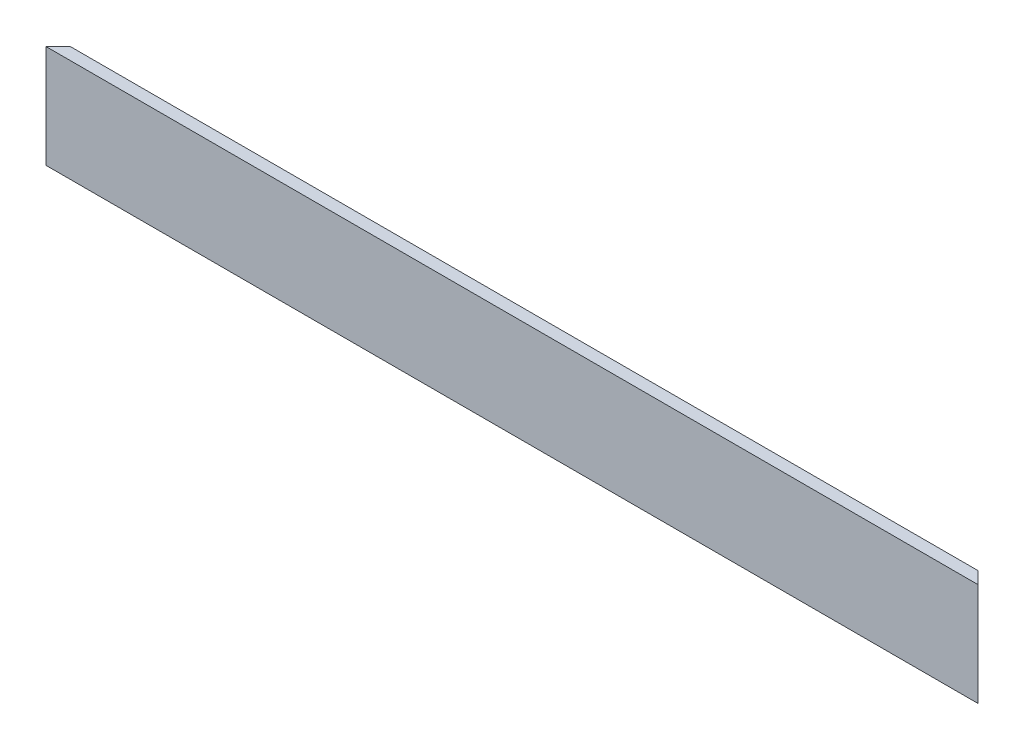
ISO-10303-21;
HEADER;
FILE_DESCRIPTION(('STEP AP214'),'2;1');
FILE_NAME('part.step','',(''),(''),'','','');
FILE_SCHEMA(('AUTOMOTIVE_DESIGN { 1 0 10303 214 1 1 1 1 }'));
ENDSEC;
DATA;
#1=APPLICATION_CONTEXT('core data for automotive mechanical design processes');
#2=APPLICATION_PROTOCOL_DEFINITION('international standard','automotive_design',2000,#1);
#3=PRODUCT_CONTEXT('',#1,'mechanical');
#4=PRODUCT('Part','Part','',(#3));
#5=PRODUCT_RELATED_PRODUCT_CATEGORY('part','',(#4));
#6=PRODUCT_DEFINITION_FORMATION('','',#4);
#7=PRODUCT_DEFINITION_CONTEXT('part definition',#1,'design');
#8=PRODUCT_DEFINITION('design','',#6,#7);
#9=PRODUCT_DEFINITION_SHAPE('','',#8);
#10=(LENGTH_UNIT() NAMED_UNIT(*) SI_UNIT(.MILLI.,.METRE.));
#11=(NAMED_UNIT(*) PLANE_ANGLE_UNIT() SI_UNIT($,.RADIAN.));
#12=(NAMED_UNIT(*) SI_UNIT($,.STERADIAN.) SOLID_ANGLE_UNIT());
#13=UNCERTAINTY_MEASURE_WITH_UNIT(LENGTH_MEASURE(1.E-05),#10,'distance_accuracy_value','');
#14=(GEOMETRIC_REPRESENTATION_CONTEXT(3) GLOBAL_UNCERTAINTY_ASSIGNED_CONTEXT((#13)) GLOBAL_UNIT_ASSIGNED_CONTEXT((#10,
#11,#12)) REPRESENTATION_CONTEXT('',''));
#15=CARTESIAN_POINT('',(0.,0.,0.));
#16=DIRECTION('',(0.,0.,1.));
#17=DIRECTION('',(1.,0.,0.));
#18=AXIS2_PLACEMENT_3D('',#15,#16,#17);
#19=CARTESIAN_POINT('',(230.,6.35,16.8742989565129));
#20=DIRECTION('',(0.,-1.,0.));
#21=DIRECTION('',(0.,0.,-1.));
#22=AXIS2_PLACEMENT_3D('',#19,#20,#21);
#23=PLANE('',#22);
#24=DIRECTION('',(0.707106781186551,0.,-0.707106781186544));
#25=VECTOR('',#24,1.);
#26=CARTESIAN_POINT('',(0.,6.35,16.8742989565129));
#27=LINE('',#26,#25);
#28=CARTESIAN_POINT('',(0.,6.35,16.8742989565129));
#29=VERTEX_POINT('',#28);
#30=CARTESIAN_POINT('',(3.00000000000003,6.35,13.8742989565129));
#31=VERTEX_POINT('',#30);
#32=EDGE_CURVE('E62',#29,#31,#27,.T.);
#33=ORIENTED_EDGE('',*,*,#32,.F.);
#34=DIRECTION('',(-1.,0.,0.));
#35=VECTOR('',#34,1.);
#36=CARTESIAN_POINT('',(230.,6.35,16.8742989565129));
#37=LINE('',#36,#35);
#38=CARTESIAN_POINT('',(230.,6.35,16.8742989565129));
#39=VERTEX_POINT('',#38);
#40=EDGE_CURVE('E102',#39,#29,#37,.T.);
#41=ORIENTED_EDGE('',*,*,#40,.F.);
#42=DIRECTION('',(0.707106781186551,0.,0.707106781186544));
#43=VECTOR('',#42,1.);
#44=CARTESIAN_POINT('',(230.,6.35,16.8742989565129));
#45=LINE('',#44,#43);
#46=CARTESIAN_POINT('',(227.,6.35,13.8742989565129));
#47=VERTEX_POINT('',#46);
#48=EDGE_CURVE('E107',#47,#39,#45,.T.);
#49=ORIENTED_EDGE('',*,*,#48,.F.);
#50=DIRECTION('',(-1.,0.,0.));
#51=VECTOR('',#50,1.);
#52=CARTESIAN_POINT('',(230.,6.35,13.8742989565129));
#53=LINE('',#52,#51);
#54=EDGE_CURVE('E106',#47,#31,#53,.T.);
#55=ORIENTED_EDGE('',*,*,#54,.T.);
#56=EDGE_LOOP('',(#33,#41,#49,#55));
#57=FACE_BOUND('',#56,.T.);
#58=ADVANCED_FACE('F41',(#57),#23,.F.);
#59=CARTESIAN_POINT('',(230.,-19.05,-8.52570104348712));
#60=DIRECTION('',(0.,0.,1.));
#61=DIRECTION('',(1.,0.,0.));
#62=AXIS2_PLACEMENT_3D('',#59,#60,#61);
#63=PLANE('',#62);
#64=DIRECTION('',(-1.,0.,0.));
#65=VECTOR('',#64,1.);
#66=CARTESIAN_POINT('',(230.,-19.05,-8.52570104348712));
#67=LINE('',#66,#65);
#68=CARTESIAN_POINT('',(204.6,-19.05,-8.52570104348712));
#69=VERTEX_POINT('',#68);
#70=CARTESIAN_POINT('',(25.4000000000003,-19.05,-8.52570104348712));
#71=VERTEX_POINT('',#70);
#72=EDGE_CURVE('E111',#69,#71,#67,.T.);
#73=ORIENTED_EDGE('',*,*,#72,.T.);
#74=DIRECTION('',(0.,1.,0.));
#75=VECTOR('',#74,1.);
#76=CARTESIAN_POINT('',(25.4000000000003,-68.65,-8.52570104348712));
#77=LINE('',#76,#75);
#78=CARTESIAN_POINT('',(25.4000000000003,-16.05,-8.52570104348712));
#79=VERTEX_POINT('',#78);
#80=EDGE_CURVE('E110',#71,#79,#77,.T.);
#81=ORIENTED_EDGE('',*,*,#80,.T.);
#82=DIRECTION('',(-1.,0.,0.));
#83=VECTOR('',#82,1.);
#84=CARTESIAN_POINT('',(230.,-16.05,-8.52570104348712));
#85=LINE('',#84,#83);
#86=CARTESIAN_POINT('',(204.6,-16.05,-8.52570104348712));
#87=VERTEX_POINT('',#86);
#88=EDGE_CURVE('E120',#87,#79,#85,.T.);
#89=ORIENTED_EDGE('',*,*,#88,.F.);
#90=DIRECTION('',(0.,1.,0.));
#91=VECTOR('',#90,1.);
#92=CARTESIAN_POINT('',(204.6,-68.65,-8.52570104348712));
#93=LINE('',#92,#91);
#94=EDGE_CURVE('E139',#69,#87,#93,.T.);
#95=ORIENTED_EDGE('',*,*,#94,.F.);
#96=EDGE_LOOP('',(#73,#81,#89,#95));
#97=FACE_BOUND('',#96,.T.);
#98=ADVANCED_FACE('F143',(#97),#63,.F.);
#99=CARTESIAN_POINT('',(230.,6.35,16.8742989565129));
#100=DIRECTION('',(0.,0.,-1.));
#101=DIRECTION('',(0.,1.,0.));
#102=AXIS2_PLACEMENT_3D('',#99,#100,#101);
#103=PLANE('',#102);
#104=DIRECTION('',(0.,-1.,0.));
#105=VECTOR('',#104,1.);
#106=CARTESIAN_POINT('',(0.,6.35,16.8742989565129));
#107=LINE('',#106,#105);
#108=CARTESIAN_POINT('',(0.,-19.05,16.8742989565129));
#109=VERTEX_POINT('',#108);
#110=EDGE_CURVE('E89',#29,#109,#107,.T.);
#111=ORIENTED_EDGE('',*,*,#110,.T.);
#112=DIRECTION('',(-1.,0.,0.));
#113=VECTOR('',#112,1.);
#114=CARTESIAN_POINT('',(230.,-19.05,16.8742989565129));
#115=LINE('',#114,#113);
#116=CARTESIAN_POINT('',(230.,-19.05,16.8742989565129));
#117=VERTEX_POINT('',#116);
#118=EDGE_CURVE('E115',#117,#109,#115,.T.);
#119=ORIENTED_EDGE('',*,*,#118,.F.);
#120=DIRECTION('',(0.,-1.,0.));
#121=VECTOR('',#120,1.);
#122=CARTESIAN_POINT('',(230.,6.35,16.8742989565129));
#123=LINE('',#122,#121);
#124=EDGE_CURVE('E98',#39,#117,#123,.T.);
#125=ORIENTED_EDGE('',*,*,#124,.F.);
#126=ORIENTED_EDGE('',*,*,#40,.T.);
#127=EDGE_LOOP('',(#111,#119,#125,#126));
#128=FACE_BOUND('',#127,.T.);
#129=ADVANCED_FACE('F112',(#128),#103,.F.);
#130=CARTESIAN_POINT('',(230.,-19.05,16.8742989565129));
#131=DIRECTION('',(0.,1.,0.));
#132=DIRECTION('',(0.,0.,1.));
#133=AXIS2_PLACEMENT_3D('',#130,#131,#132);
#134=PLANE('',#133);
#135=ORIENTED_EDGE('',*,*,#118,.T.);
#136=DIRECTION('',(0.707106781186551,0.,-0.707106781186544));
#137=VECTOR('',#136,1.);
#138=CARTESIAN_POINT('',(115.000000000001,-19.05,-98.1257010434871));
#139=LINE('',#138,#137);
#140=EDGE_CURVE('E91',#109,#71,#139,.T.);
#141=ORIENTED_EDGE('',*,*,#140,.T.);
#142=ORIENTED_EDGE('',*,*,#72,.F.);
#143=DIRECTION('',(0.707106781186551,0.,0.707106781186544));
#144=VECTOR('',#143,1.);
#145=CARTESIAN_POINT('',(230.,-19.05,16.8742989565129));
#146=LINE('',#145,#144);
#147=EDGE_CURVE('E133',#69,#117,#146,.T.);
#148=ORIENTED_EDGE('',*,*,#147,.T.);
#149=EDGE_LOOP('',(#135,#141,#142,#148));
#150=FACE_BOUND('',#149,.T.);
#151=ADVANCED_FACE('F151',(#150),#134,.F.);
#152=CARTESIAN_POINT('',(230.,-16.05,-8.52570104348712));
#153=DIRECTION('',(0.,-1.,0.));
#154=DIRECTION('',(0.,0.,-1.));
#155=AXIS2_PLACEMENT_3D('',#152,#153,#154);
#156=PLANE('',#155);
#157=ORIENTED_EDGE('',*,*,#88,.T.);
#158=DIRECTION('',(-0.707106781186551,0.,0.707106781186544));
#159=VECTOR('',#158,1.);
#160=CARTESIAN_POINT('',(127.700000000001,-16.05,-110.825701043487));
#161=LINE('',#160,#159);
#162=CARTESIAN_POINT('',(3.00000000000006,-16.05,13.8742989565129));
#163=VERTEX_POINT('',#162);
#164=EDGE_CURVE('E126',#79,#163,#161,.T.);
#165=ORIENTED_EDGE('',*,*,#164,.T.);
#166=DIRECTION('',(-1.,0.,0.));
#167=VECTOR('',#166,1.);
#168=CARTESIAN_POINT('',(230.,-16.05,13.8742989565129));
#169=LINE('',#168,#167);
#170=CARTESIAN_POINT('',(227.,-16.05,13.8742989565129));
#171=VERTEX_POINT('',#170);
#172=EDGE_CURVE('E121',#171,#163,#169,.T.);
#173=ORIENTED_EDGE('',*,*,#172,.F.);
#174=DIRECTION('',(-0.707106781186551,0.,-0.707106781186544));
#175=VECTOR('',#174,1.);
#176=CARTESIAN_POINT('',(217.3,-16.05,4.17429895651301));
#177=LINE('',#176,#175);
#178=EDGE_CURVE('E54',#171,#87,#177,.T.);
#179=ORIENTED_EDGE('',*,*,#178,.T.);
#180=EDGE_LOOP('',(#157,#165,#173,#179));
#181=FACE_BOUND('',#180,.T.);
#182=ADVANCED_FACE('F144',(#181),#156,.F.);
#183=CARTESIAN_POINT('',(230.,-16.05,13.8742989565129));
#184=DIRECTION('',(0.,0.,1.));
#185=DIRECTION('',(1.,0.,0.));
#186=AXIS2_PLACEMENT_3D('',#183,#184,#185);
#187=PLANE('',#186);
#188=ORIENTED_EDGE('',*,*,#172,.T.);
#189=DIRECTION('',(0.,1.,0.));
#190=VECTOR('',#189,1.);
#191=CARTESIAN_POINT('',(3.00000000000006,-16.05,13.8742989565129));
#192=LINE('',#191,#190);
#193=EDGE_CURVE('E11',#163,#31,#192,.T.);
#194=ORIENTED_EDGE('',*,*,#193,.T.);
#195=ORIENTED_EDGE('',*,*,#54,.F.);
#196=DIRECTION('',(0.,-1.,0.));
#197=VECTOR('',#196,1.);
#198=CARTESIAN_POINT('',(227.,-16.05,13.8742989565129));
#199=LINE('',#198,#197);
#200=EDGE_CURVE('E48',#47,#171,#199,.T.);
#201=ORIENTED_EDGE('',*,*,#200,.T.);
#202=EDGE_LOOP('',(#188,#194,#195,#201));
#203=FACE_BOUND('',#202,.T.);
#204=ADVANCED_FACE('F146',(#203),#187,.F.);
#205=CARTESIAN_POINT('',(230.,-68.65,16.8742989565129));
#206=DIRECTION('',(-0.707106781186544,0.,0.707106781186551));
#207=DIRECTION('',(0.707106781186551,0.,0.707106781186544));
#208=AXIS2_PLACEMENT_3D('',#205,#206,#207);
#209=PLANE('',#208);
#210=ORIENTED_EDGE('',*,*,#94,.T.);
#211=ORIENTED_EDGE('',*,*,#178,.F.);
#212=ORIENTED_EDGE('',*,*,#200,.F.);
#213=ORIENTED_EDGE('',*,*,#48,.T.);
#214=ORIENTED_EDGE('',*,*,#124,.T.);
#215=ORIENTED_EDGE('',*,*,#147,.F.);
#216=EDGE_LOOP('',(#210,#211,#212,#213,#214,#215));
#217=FACE_BOUND('',#216,.T.);
#218=ADVANCED_FACE('F149',(#217),#209,.F.);
#219=CARTESIAN_POINT('',(0.,-68.65,16.8742989565129));
#220=DIRECTION('',(0.707106781186544,0.,0.707106781186552));
#221=DIRECTION('',(0.707106781186551,0.,-0.707106781186544));
#222=AXIS2_PLACEMENT_3D('',#219,#220,#221);
#223=PLANE('',#222);
#224=ORIENTED_EDGE('',*,*,#110,.F.);
#225=ORIENTED_EDGE('',*,*,#32,.T.);
#226=ORIENTED_EDGE('',*,*,#193,.F.);
#227=ORIENTED_EDGE('',*,*,#164,.F.);
#228=ORIENTED_EDGE('',*,*,#80,.F.);
#229=ORIENTED_EDGE('',*,*,#140,.F.);
#230=EDGE_LOOP('',(#224,#225,#226,#227,#228,#229));
#231=FACE_BOUND('',#230,.T.);
#232=ADVANCED_FACE('F93',(#231),#223,.F.);
#233=CLOSED_SHELL('',(#58,#98,#129,#151,#182,#204,#218,#232));
#234=MANIFOLD_SOLID_BREP('B2',#233);
#235=ADVANCED_BREP_SHAPE_REPRESENTATION('',(#18,#234),#14);
#236=SHAPE_DEFINITION_REPRESENTATION(#9,#235);
ENDSEC;
END-ISO-10303-21;
